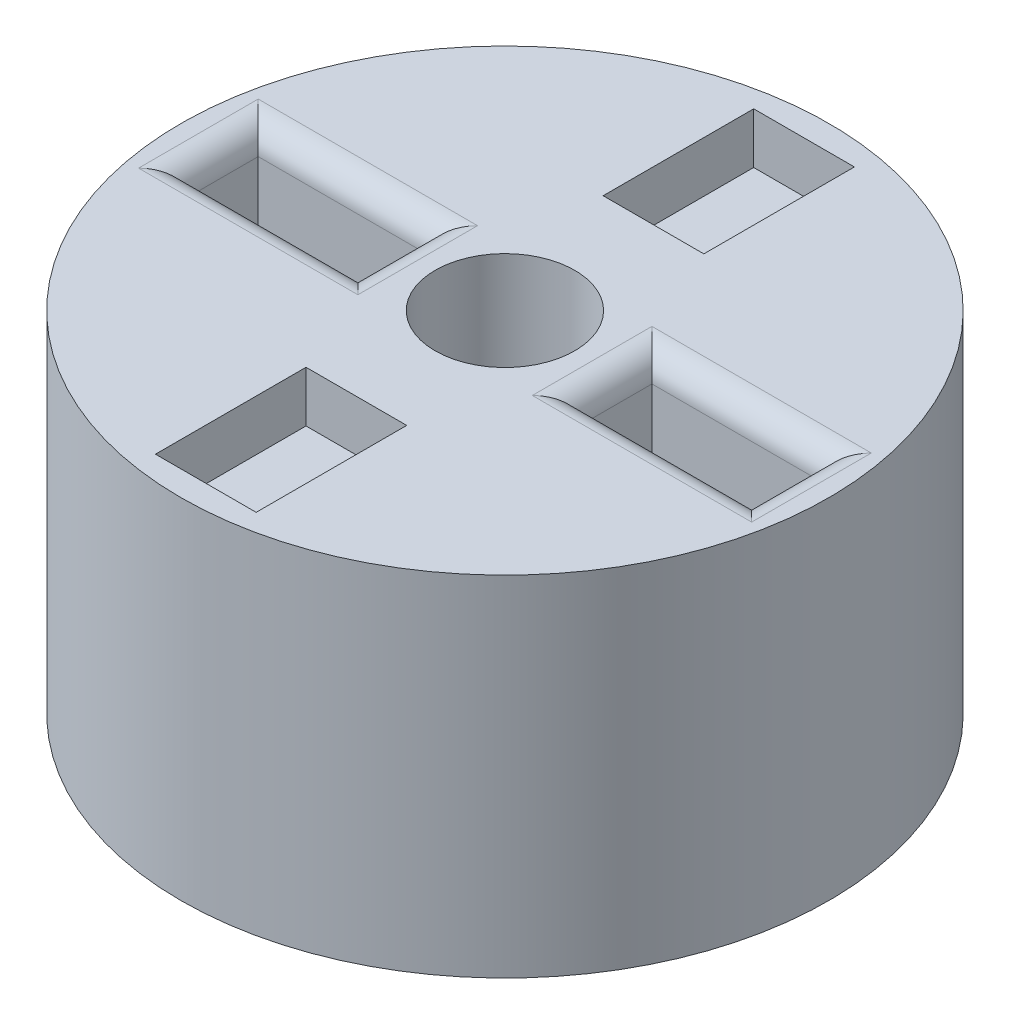
ISO-10303-21;
HEADER;
FILE_DESCRIPTION(('STEP AP214'),'2;1');
FILE_NAME('part.step','',(''),(''),'','','');
FILE_SCHEMA(('AUTOMOTIVE_DESIGN { 1 0 10303 214 1 1 1 1 }'));
ENDSEC;
DATA;
#1=APPLICATION_CONTEXT('core data for automotive mechanical design processes');
#2=APPLICATION_PROTOCOL_DEFINITION('international standard','automotive_design',2000,#1);
#3=PRODUCT_CONTEXT('',#1,'mechanical');
#4=PRODUCT('Part','Part','',(#3));
#5=PRODUCT_RELATED_PRODUCT_CATEGORY('part','',(#4));
#6=PRODUCT_DEFINITION_FORMATION('','',#4);
#7=PRODUCT_DEFINITION_CONTEXT('part definition',#1,'design');
#8=PRODUCT_DEFINITION('design','',#6,#7);
#9=PRODUCT_DEFINITION_SHAPE('','',#8);
#10=(LENGTH_UNIT() NAMED_UNIT(*) SI_UNIT(.MILLI.,.METRE.));
#11=(NAMED_UNIT(*) PLANE_ANGLE_UNIT() SI_UNIT($,.RADIAN.));
#12=(NAMED_UNIT(*) SI_UNIT($,.STERADIAN.) SOLID_ANGLE_UNIT());
#13=UNCERTAINTY_MEASURE_WITH_UNIT(LENGTH_MEASURE(1.E-05),#10,'distance_accuracy_value','');
#14=(GEOMETRIC_REPRESENTATION_CONTEXT(3) GLOBAL_UNCERTAINTY_ASSIGNED_CONTEXT((#13)) GLOBAL_UNIT_ASSIGNED_CONTEXT((#10,
#11,#12)) REPRESENTATION_CONTEXT('',''));
#15=CARTESIAN_POINT('',(0.,0.,0.));
#16=DIRECTION('',(0.,0.,1.));
#17=DIRECTION('',(1.,0.,0.));
#18=AXIS2_PLACEMENT_3D('',#15,#16,#17);
#19=CARTESIAN_POINT('',(0.,35.,0.));
#20=DIRECTION('',(0.,-1.,0.));
#21=DIRECTION('',(0.,0.,-1.));
#22=AXIS2_PLACEMENT_3D('',#19,#20,#21);
#23=CYLINDRICAL_SURFACE('',#22,32.5);
#24=CARTESIAN_POINT('',(0.,35.,0.));
#25=DIRECTION('',(0.,1.,0.));
#26=DIRECTION('',(0.,0.,1.));
#27=AXIS2_PLACEMENT_3D('',#24,#25,#26);
#28=CIRCLE('',#27,32.5);
#29=CARTESIAN_POINT('',(0.,35.,32.5));
#30=VERTEX_POINT('',#29);
#31=EDGE_CURVE('E307',#30,#30,#28,.T.);
#32=ORIENTED_EDGE('',*,*,#31,.F.);
#33=EDGE_LOOP('',(#32));
#34=FACE_BOUND('',#33,.T.);
#35=CARTESIAN_POINT('',(0.,0.,0.));
#36=DIRECTION('',(0.,1.,0.));
#37=DIRECTION('',(0.,0.,1.));
#38=AXIS2_PLACEMENT_3D('',#35,#36,#37);
#39=CIRCLE('',#38,32.5);
#40=CARTESIAN_POINT('',(0.,0.,32.5));
#41=VERTEX_POINT('',#40);
#42=EDGE_CURVE('E270',#41,#41,#39,.T.);
#43=ORIENTED_EDGE('',*,*,#42,.T.);
#44=EDGE_LOOP('',(#43));
#45=FACE_BOUND('',#44,.T.);
#46=ADVANCED_FACE('F41',(#34,#45),#23,.T.);
#47=CARTESIAN_POINT('',(0.,35.,0.));
#48=DIRECTION('',(0.,1.,0.));
#49=DIRECTION('',(0.,0.,1.));
#50=AXIS2_PLACEMENT_3D('',#47,#48,#49);
#51=PLANE('',#50);
#52=DIRECTION('',(-1.,0.,0.));
#53=VECTOR('',#52,1.);
#54=CARTESIAN_POINT('',(28.2461754734144,35.,-6.));
#55=LINE('',#54,#53);
#56=CARTESIAN_POINT('',(8.74617547341436,35.,-6.));
#57=VERTEX_POINT('',#56);
#58=CARTESIAN_POINT('',(30.7461754734144,35.,-6.));
#59=VERTEX_POINT('',#58);
#60=EDGE_CURVE('E322',#57,#59,#55,.F.);
#61=ORIENTED_EDGE('',*,*,#60,.T.);
#62=DIRECTION('',(0.,0.,-1.));
#63=VECTOR('',#62,1.);
#64=CARTESIAN_POINT('',(30.7461754734144,35.,3.5));
#65=LINE('',#64,#63);
#66=CARTESIAN_POINT('',(30.7461754734144,35.,6.));
#67=VERTEX_POINT('',#66);
#68=EDGE_CURVE('E328',#59,#67,#65,.F.);
#69=ORIENTED_EDGE('',*,*,#68,.T.);
#70=DIRECTION('',(1.,0.,0.));
#71=VECTOR('',#70,1.);
#72=CARTESIAN_POINT('',(11.2461754734144,35.,6.));
#73=LINE('',#72,#71);
#74=CARTESIAN_POINT('',(8.74617547341436,35.,6.));
#75=VERTEX_POINT('',#74);
#76=EDGE_CURVE('E326',#67,#75,#73,.F.);
#77=ORIENTED_EDGE('',*,*,#76,.T.);
#78=DIRECTION('',(0.,0.,1.));
#79=VECTOR('',#78,1.);
#80=CARTESIAN_POINT('',(8.74617547341436,35.,-3.5));
#81=LINE('',#80,#79);
#82=EDGE_CURVE('E324',#75,#57,#81,.F.);
#83=ORIENTED_EDGE('',*,*,#82,.T.);
#84=EDGE_LOOP('',(#61,#69,#77,#83));
#85=FACE_BOUND('',#84,.T.);
#86=DIRECTION('',(1.,0.,0.));
#87=VECTOR('',#86,1.);
#88=CARTESIAN_POINT('',(-28.2461754734144,35.,6.));
#89=LINE('',#88,#87);
#90=CARTESIAN_POINT('',(-8.74617547341436,35.,6.));
#91=VERTEX_POINT('',#90);
#92=CARTESIAN_POINT('',(-30.7461754734144,35.,6.));
#93=VERTEX_POINT('',#92);
#94=EDGE_CURVE('E317',#91,#93,#89,.F.);
#95=ORIENTED_EDGE('',*,*,#94,.T.);
#96=DIRECTION('',(0.,0.,1.));
#97=VECTOR('',#96,1.);
#98=CARTESIAN_POINT('',(-30.7461754734144,35.,-3.5));
#99=LINE('',#98,#97);
#100=CARTESIAN_POINT('',(-30.7461754734144,35.,-6.));
#101=VERTEX_POINT('',#100);
#102=EDGE_CURVE('E319',#93,#101,#99,.F.);
#103=ORIENTED_EDGE('',*,*,#102,.T.);
#104=DIRECTION('',(-1.,0.,0.));
#105=VECTOR('',#104,1.);
#106=CARTESIAN_POINT('',(-11.2461754734144,35.,-6.));
#107=LINE('',#106,#105);
#108=CARTESIAN_POINT('',(-8.74617547341436,35.,-6.));
#109=VERTEX_POINT('',#108);
#110=EDGE_CURVE('E313',#101,#109,#107,.F.);
#111=ORIENTED_EDGE('',*,*,#110,.T.);
#112=DIRECTION('',(0.,0.,-1.));
#113=VECTOR('',#112,1.);
#114=CARTESIAN_POINT('',(-8.74617547341436,35.,3.5));
#115=LINE('',#114,#113);
#116=EDGE_CURVE('E315',#109,#91,#115,.F.);
#117=ORIENTED_EDGE('',*,*,#116,.T.);
#118=EDGE_LOOP('',(#95,#103,#111,#117));
#119=FACE_BOUND('',#118,.T.);
#120=CARTESIAN_POINT('',(0.,35.,0.));
#121=DIRECTION('',(0.,1.,0.));
#122=DIRECTION('',(0.,0.,1.));
#123=AXIS2_PLACEMENT_3D('',#120,#121,#122);
#124=CIRCLE('',#123,7.);
#125=CARTESIAN_POINT('',(0.,35.,7.));
#126=VERTEX_POINT('',#125);
#127=EDGE_CURVE('E214',#126,#126,#124,.T.);
#128=ORIENTED_EDGE('',*,*,#127,.F.);
#129=EDGE_LOOP('',(#128));
#130=FACE_BOUND('',#129,.T.);
#131=DIRECTION('',(0.,0.,-1.));
#132=VECTOR('',#131,1.);
#133=CARTESIAN_POINT('',(5.05,35.,-30.));
#134=LINE('',#133,#132);
#135=CARTESIAN_POINT('',(5.05,35.,-14.9));
#136=VERTEX_POINT('',#135);
#137=CARTESIAN_POINT('',(5.05,35.,-30.));
#138=VERTEX_POINT('',#137);
#139=EDGE_CURVE('E257',#136,#138,#134,.T.);
#140=ORIENTED_EDGE('',*,*,#139,.F.);
#141=DIRECTION('',(1.,0.,0.));
#142=VECTOR('',#141,1.);
#143=CARTESIAN_POINT('',(-5.05,35.,-14.9));
#144=LINE('',#143,#142);
#145=CARTESIAN_POINT('',(-5.05,35.,-14.9));
#146=VERTEX_POINT('',#145);
#147=EDGE_CURVE('E247',#146,#136,#144,.T.);
#148=ORIENTED_EDGE('',*,*,#147,.F.);
#149=DIRECTION('',(0.,0.,1.));
#150=VECTOR('',#149,1.);
#151=CARTESIAN_POINT('',(-5.05,35.,-30.));
#152=LINE('',#151,#150);
#153=CARTESIAN_POINT('',(-5.05,35.,-30.));
#154=VERTEX_POINT('',#153);
#155=EDGE_CURVE('E263',#154,#146,#152,.T.);
#156=ORIENTED_EDGE('',*,*,#155,.F.);
#157=DIRECTION('',(-1.,0.,0.));
#158=VECTOR('',#157,1.);
#159=CARTESIAN_POINT('',(-5.05,35.,-30.));
#160=LINE('',#159,#158);
#161=EDGE_CURVE('E259',#138,#154,#160,.T.);
#162=ORIENTED_EDGE('',*,*,#161,.F.);
#163=EDGE_LOOP('',(#140,#148,#156,#162));
#164=FACE_BOUND('',#163,.T.);
#165=DIRECTION('',(1.,0.,0.));
#166=VECTOR('',#165,1.);
#167=CARTESIAN_POINT('',(-5.04999999999999,35.,30.));
#168=LINE('',#167,#166);
#169=CARTESIAN_POINT('',(-5.04999999999999,35.,30.));
#170=VERTEX_POINT('',#169);
#171=CARTESIAN_POINT('',(5.05,35.,30.));
#172=VERTEX_POINT('',#171);
#173=EDGE_CURVE('E260',#170,#172,#168,.T.);
#174=ORIENTED_EDGE('',*,*,#173,.F.);
#175=DIRECTION('',(0.,0.,1.));
#176=VECTOR('',#175,1.);
#177=CARTESIAN_POINT('',(-5.04999999999999,35.,30.));
#178=LINE('',#177,#176);
#179=CARTESIAN_POINT('',(-5.04999999999999,35.,14.9));
#180=VERTEX_POINT('',#179);
#181=EDGE_CURVE('E286',#180,#170,#178,.T.);
#182=ORIENTED_EDGE('',*,*,#181,.F.);
#183=DIRECTION('',(-1.,0.,0.));
#184=VECTOR('',#183,1.);
#185=CARTESIAN_POINT('',(-5.04999999999999,35.,14.9));
#186=LINE('',#185,#184);
#187=CARTESIAN_POINT('',(5.05,35.,14.9));
#188=VERTEX_POINT('',#187);
#189=EDGE_CURVE('E289',#188,#180,#186,.T.);
#190=ORIENTED_EDGE('',*,*,#189,.F.);
#191=DIRECTION('',(0.,0.,-1.));
#192=VECTOR('',#191,1.);
#193=CARTESIAN_POINT('',(5.05,35.,30.));
#194=LINE('',#193,#192);
#195=EDGE_CURVE('E293',#172,#188,#194,.T.);
#196=ORIENTED_EDGE('',*,*,#195,.F.);
#197=EDGE_LOOP('',(#174,#182,#190,#196));
#198=FACE_BOUND('',#197,.T.);
#199=ORIENTED_EDGE('',*,*,#31,.T.);
#200=EDGE_LOOP('',(#199));
#201=FACE_BOUND('',#200,.T.);
#202=ADVANCED_FACE('F369',(#85,#119,#130,#164,#198,#201),#51,.T.);
#203=CARTESIAN_POINT('',(0.,0.,0.));
#204=DIRECTION('',(0.,1.,0.));
#205=DIRECTION('',(0.,0.,1.));
#206=AXIS2_PLACEMENT_3D('',#203,#204,#205);
#207=PLANE('',#206);
#208=CARTESIAN_POINT('',(0.,0.,0.));
#209=DIRECTION('',(0.,1.,0.));
#210=DIRECTION('',(0.,0.,1.));
#211=AXIS2_PLACEMENT_3D('',#208,#209,#210);
#212=CIRCLE('',#211,7.);
#213=CARTESIAN_POINT('',(0.,0.,7.));
#214=VERTEX_POINT('',#213);
#215=EDGE_CURVE('E237',#214,#214,#212,.T.);
#216=ORIENTED_EDGE('',*,*,#215,.T.);
#217=EDGE_LOOP('',(#216));
#218=FACE_BOUND('',#217,.T.);
#219=ORIENTED_EDGE('',*,*,#42,.F.);
#220=EDGE_LOOP('',(#219));
#221=FACE_BOUND('',#220,.T.);
#222=ADVANCED_FACE('F406',(#218,#221),#207,.F.);
#223=CARTESIAN_POINT('',(-5.04999999999999,29.9,30.));
#224=DIRECTION('',(0.,0.,1.));
#225=DIRECTION('',(1.,0.,0.));
#226=AXIS2_PLACEMENT_3D('',#223,#224,#225);
#227=PLANE('',#226);
#228=ORIENTED_EDGE('',*,*,#173,.T.);
#229=DIRECTION('',(0.,1.,0.));
#230=VECTOR('',#229,1.);
#231=CARTESIAN_POINT('',(5.05,29.9,30.));
#232=LINE('',#231,#230);
#233=CARTESIAN_POINT('',(5.05,29.9,30.));
#234=VERTEX_POINT('',#233);
#235=EDGE_CURVE('E277',#234,#172,#232,.T.);
#236=ORIENTED_EDGE('',*,*,#235,.F.);
#237=DIRECTION('',(1.,0.,0.));
#238=VECTOR('',#237,1.);
#239=CARTESIAN_POINT('',(-5.04999999999999,29.9,30.));
#240=LINE('',#239,#238);
#241=CARTESIAN_POINT('',(-5.04999999999999,29.9,30.));
#242=VERTEX_POINT('',#241);
#243=EDGE_CURVE('E290',#242,#234,#240,.T.);
#244=ORIENTED_EDGE('',*,*,#243,.F.);
#245=DIRECTION('',(0.,1.,0.));
#246=VECTOR('',#245,1.);
#247=CARTESIAN_POINT('',(-5.04999999999999,29.9,30.));
#248=LINE('',#247,#246);
#249=EDGE_CURVE('E240',#242,#170,#248,.T.);
#250=ORIENTED_EDGE('',*,*,#249,.T.);
#251=EDGE_LOOP('',(#228,#236,#244,#250));
#252=FACE_BOUND('',#251,.T.);
#253=ADVANCED_FACE('F624',(#252),#227,.F.);
#254=CARTESIAN_POINT('',(-5.04999999999999,29.9,30.));
#255=DIRECTION('',(-1.,0.,0.));
#256=DIRECTION('',(0.,0.,1.));
#257=AXIS2_PLACEMENT_3D('',#254,#255,#256);
#258=PLANE('',#257);
#259=ORIENTED_EDGE('',*,*,#181,.T.);
#260=ORIENTED_EDGE('',*,*,#249,.F.);
#261=DIRECTION('',(0.,0.,1.));
#262=VECTOR('',#261,1.);
#263=CARTESIAN_POINT('',(-5.04999999999999,29.9,30.));
#264=LINE('',#263,#262);
#265=CARTESIAN_POINT('',(-5.04999999999999,29.9,14.9));
#266=VERTEX_POINT('',#265);
#267=EDGE_CURVE('E280',#266,#242,#264,.T.);
#268=ORIENTED_EDGE('',*,*,#267,.F.);
#269=DIRECTION('',(0.,1.,0.));
#270=VECTOR('',#269,1.);
#271=CARTESIAN_POINT('',(-5.04999999999999,29.9,14.9));
#272=LINE('',#271,#270);
#273=EDGE_CURVE('E283',#266,#180,#272,.T.);
#274=ORIENTED_EDGE('',*,*,#273,.T.);
#275=EDGE_LOOP('',(#259,#260,#268,#274));
#276=FACE_BOUND('',#275,.T.);
#277=ADVANCED_FACE('F614',(#276),#258,.F.);
#278=CARTESIAN_POINT('',(-5.04999999999999,29.9,14.9));
#279=DIRECTION('',(0.,0.,-1.));
#280=DIRECTION('',(-1.,0.,0.));
#281=AXIS2_PLACEMENT_3D('',#278,#279,#280);
#282=PLANE('',#281);
#283=ORIENTED_EDGE('',*,*,#189,.T.);
#284=ORIENTED_EDGE('',*,*,#273,.F.);
#285=DIRECTION('',(-1.,0.,0.));
#286=VECTOR('',#285,1.);
#287=CARTESIAN_POINT('',(-5.04999999999999,29.9,14.9));
#288=LINE('',#287,#286);
#289=CARTESIAN_POINT('',(5.05,29.9,14.9));
#290=VERTEX_POINT('',#289);
#291=EDGE_CURVE('E299',#290,#266,#288,.T.);
#292=ORIENTED_EDGE('',*,*,#291,.F.);
#293=DIRECTION('',(0.,1.,0.));
#294=VECTOR('',#293,1.);
#295=CARTESIAN_POINT('',(5.05,29.9,14.9));
#296=LINE('',#295,#294);
#297=EDGE_CURVE('E281',#290,#188,#296,.T.);
#298=ORIENTED_EDGE('',*,*,#297,.T.);
#299=EDGE_LOOP('',(#283,#284,#292,#298));
#300=FACE_BOUND('',#299,.T.);
#301=ADVANCED_FACE('F604',(#300),#282,.F.);
#302=CARTESIAN_POINT('',(5.05,29.9,30.));
#303=DIRECTION('',(1.,0.,0.));
#304=DIRECTION('',(0.,0.,-1.));
#305=AXIS2_PLACEMENT_3D('',#302,#303,#304);
#306=PLANE('',#305);
#307=ORIENTED_EDGE('',*,*,#195,.T.);
#308=ORIENTED_EDGE('',*,*,#297,.F.);
#309=DIRECTION('',(0.,0.,-1.));
#310=VECTOR('',#309,1.);
#311=CARTESIAN_POINT('',(5.05,29.9,30.));
#312=LINE('',#311,#310);
#313=EDGE_CURVE('E302',#234,#290,#312,.T.);
#314=ORIENTED_EDGE('',*,*,#313,.F.);
#315=ORIENTED_EDGE('',*,*,#235,.T.);
#316=EDGE_LOOP('',(#307,#308,#314,#315));
#317=FACE_BOUND('',#316,.T.);
#318=ADVANCED_FACE('F594',(#317),#306,.F.);
#319=CARTESIAN_POINT('',(0.,29.9,0.));
#320=DIRECTION('',(0.,1.,0.));
#321=DIRECTION('',(0.,0.,1.));
#322=AXIS2_PLACEMENT_3D('',#319,#320,#321);
#323=PLANE('',#322);
#324=ORIENTED_EDGE('',*,*,#243,.T.);
#325=ORIENTED_EDGE('',*,*,#313,.T.);
#326=ORIENTED_EDGE('',*,*,#291,.T.);
#327=ORIENTED_EDGE('',*,*,#267,.T.);
#328=EDGE_LOOP('',(#324,#325,#326,#327));
#329=FACE_BOUND('',#328,.T.);
#330=ADVANCED_FACE('F584',(#329),#323,.T.);
#331=CARTESIAN_POINT('',(5.05,29.9,-30.));
#332=DIRECTION('',(1.,0.,0.));
#333=DIRECTION('',(0.,0.,-1.));
#334=AXIS2_PLACEMENT_3D('',#331,#332,#333);
#335=PLANE('',#334);
#336=ORIENTED_EDGE('',*,*,#139,.T.);
#337=DIRECTION('',(0.,1.,0.));
#338=VECTOR('',#337,1.);
#339=CARTESIAN_POINT('',(5.05,29.9,-30.));
#340=LINE('',#339,#338);
#341=CARTESIAN_POINT('',(5.05,29.9,-30.));
#342=VERTEX_POINT('',#341);
#343=EDGE_CURVE('E256',#342,#138,#340,.T.);
#344=ORIENTED_EDGE('',*,*,#343,.F.);
#345=DIRECTION('',(0.,0.,-1.));
#346=VECTOR('',#345,1.);
#347=CARTESIAN_POINT('',(5.05,29.9,-30.));
#348=LINE('',#347,#346);
#349=CARTESIAN_POINT('',(5.05,29.9,-14.9));
#350=VERTEX_POINT('',#349);
#351=EDGE_CURVE('E243',#350,#342,#348,.T.);
#352=ORIENTED_EDGE('',*,*,#351,.F.);
#353=DIRECTION('',(0.,1.,0.));
#354=VECTOR('',#353,1.);
#355=CARTESIAN_POINT('',(5.05,29.9,-14.9));
#356=LINE('',#355,#354);
#357=EDGE_CURVE('E268',#350,#136,#356,.T.);
#358=ORIENTED_EDGE('',*,*,#357,.T.);
#359=EDGE_LOOP('',(#336,#344,#352,#358));
#360=FACE_BOUND('',#359,.T.);
#361=ADVANCED_FACE('F574',(#360),#335,.F.);
#362=CARTESIAN_POINT('',(-5.05,29.9,-14.9));
#363=DIRECTION('',(0.,0.,1.));
#364=DIRECTION('',(1.,0.,0.));
#365=AXIS2_PLACEMENT_3D('',#362,#363,#364);
#366=PLANE('',#365);
#367=ORIENTED_EDGE('',*,*,#147,.T.);
#368=ORIENTED_EDGE('',*,*,#357,.F.);
#369=DIRECTION('',(1.,0.,0.));
#370=VECTOR('',#369,1.);
#371=CARTESIAN_POINT('',(-5.05,29.9,-14.9));
#372=LINE('',#371,#370);
#373=CARTESIAN_POINT('',(-5.05,29.9,-14.9));
#374=VERTEX_POINT('',#373);
#375=EDGE_CURVE('E253',#374,#350,#372,.T.);
#376=ORIENTED_EDGE('',*,*,#375,.F.);
#377=DIRECTION('',(0.,1.,0.));
#378=VECTOR('',#377,1.);
#379=CARTESIAN_POINT('',(-5.05,29.9,-14.9));
#380=LINE('',#379,#378);
#381=EDGE_CURVE('E271',#374,#146,#380,.T.);
#382=ORIENTED_EDGE('',*,*,#381,.T.);
#383=EDGE_LOOP('',(#367,#368,#376,#382));
#384=FACE_BOUND('',#383,.T.);
#385=ADVANCED_FACE('F564',(#384),#366,.F.);
#386=CARTESIAN_POINT('',(-5.05,29.9,-30.));
#387=DIRECTION('',(-1.,0.,0.));
#388=DIRECTION('',(0.,0.,1.));
#389=AXIS2_PLACEMENT_3D('',#386,#387,#388);
#390=PLANE('',#389);
#391=ORIENTED_EDGE('',*,*,#155,.T.);
#392=ORIENTED_EDGE('',*,*,#381,.F.);
#393=DIRECTION('',(0.,0.,1.));
#394=VECTOR('',#393,1.);
#395=CARTESIAN_POINT('',(-5.05,29.9,-30.));
#396=LINE('',#395,#394);
#397=CARTESIAN_POINT('',(-5.05,29.9,-30.));
#398=VERTEX_POINT('',#397);
#399=EDGE_CURVE('E250',#398,#374,#396,.T.);
#400=ORIENTED_EDGE('',*,*,#399,.F.);
#401=DIRECTION('',(0.,1.,0.));
#402=VECTOR('',#401,1.);
#403=CARTESIAN_POINT('',(-5.05,29.9,-30.));
#404=LINE('',#403,#402);
#405=EDGE_CURVE('E273',#398,#154,#404,.T.);
#406=ORIENTED_EDGE('',*,*,#405,.T.);
#407=EDGE_LOOP('',(#391,#392,#400,#406));
#408=FACE_BOUND('',#407,.T.);
#409=ADVANCED_FACE('F554',(#408),#390,.F.);
#410=CARTESIAN_POINT('',(-5.05,29.9,-30.));
#411=DIRECTION('',(0.,0.,-1.));
#412=DIRECTION('',(-1.,0.,0.));
#413=AXIS2_PLACEMENT_3D('',#410,#411,#412);
#414=PLANE('',#413);
#415=ORIENTED_EDGE('',*,*,#161,.T.);
#416=ORIENTED_EDGE('',*,*,#405,.F.);
#417=DIRECTION('',(-1.,0.,0.));
#418=VECTOR('',#417,1.);
#419=CARTESIAN_POINT('',(-5.05,29.9,-30.));
#420=LINE('',#419,#418);
#421=EDGE_CURVE('E246',#342,#398,#420,.T.);
#422=ORIENTED_EDGE('',*,*,#421,.F.);
#423=ORIENTED_EDGE('',*,*,#343,.T.);
#424=EDGE_LOOP('',(#415,#416,#422,#423));
#425=FACE_BOUND('',#424,.T.);
#426=ADVANCED_FACE('F544',(#425),#414,.F.);
#427=CARTESIAN_POINT('',(0.,29.9,0.));
#428=DIRECTION('',(0.,1.,0.));
#429=DIRECTION('',(0.,0.,1.));
#430=AXIS2_PLACEMENT_3D('',#427,#428,#429);
#431=PLANE('',#430);
#432=ORIENTED_EDGE('',*,*,#351,.T.);
#433=ORIENTED_EDGE('',*,*,#421,.T.);
#434=ORIENTED_EDGE('',*,*,#399,.T.);
#435=ORIENTED_EDGE('',*,*,#375,.T.);
#436=EDGE_LOOP('',(#432,#433,#434,#435));
#437=FACE_BOUND('',#436,.T.);
#438=ADVANCED_FACE('F533',(#437),#431,.T.);
#439=CARTESIAN_POINT('',(0.,0.,0.));
#440=DIRECTION('',(0.,1.,0.));
#441=DIRECTION('',(0.,0.,1.));
#442=AXIS2_PLACEMENT_3D('',#439,#440,#441);
#443=CYLINDRICAL_SURFACE('',#442,7.);
#444=ORIENTED_EDGE('',*,*,#215,.F.);
#445=EDGE_LOOP('',(#444));
#446=FACE_BOUND('',#445,.T.);
#447=ORIENTED_EDGE('',*,*,#127,.T.);
#448=EDGE_LOOP('',(#447));
#449=FACE_BOUND('',#448,.T.);
#450=ADVANCED_FACE('F526',(#446,#449),#443,.F.);
#451=CARTESIAN_POINT('',(-11.2461754734144,20.,3.5));
#452=DIRECTION('',(0.,0.,1.));
#453=DIRECTION('',(1.,0.,0.));
#454=AXIS2_PLACEMENT_3D('',#451,#452,#453);
#455=PLANE('',#454);
#456=DIRECTION('',(0.,1.,0.));
#457=VECTOR('',#456,1.);
#458=CARTESIAN_POINT('',(-28.2461754734144,20.,3.5));
#459=LINE('',#458,#457);
#460=CARTESIAN_POINT('',(-28.2461754734144,20.,3.5));
#461=VERTEX_POINT('',#460);
#462=CARTESIAN_POINT('',(-28.2461754734144,32.5,3.5));
#463=VERTEX_POINT('',#462);
#464=EDGE_CURVE('E227',#461,#463,#459,.T.);
#465=ORIENTED_EDGE('',*,*,#464,.T.);
#466=DIRECTION('',(1.,0.,0.));
#467=VECTOR('',#466,1.);
#468=CARTESIAN_POINT('',(-11.2461754734144,32.5,3.5));
#469=LINE('',#468,#467);
#470=CARTESIAN_POINT('',(-11.2461754734144,32.5,3.5));
#471=VERTEX_POINT('',#470);
#472=EDGE_CURVE('E65',#463,#471,#469,.T.);
#473=ORIENTED_EDGE('',*,*,#472,.T.);
#474=DIRECTION('',(0.,1.,0.));
#475=VECTOR('',#474,1.);
#476=CARTESIAN_POINT('',(-11.2461754734144,20.,3.5));
#477=LINE('',#476,#475);
#478=CARTESIAN_POINT('',(-11.2461754734144,20.,3.5));
#479=VERTEX_POINT('',#478);
#480=EDGE_CURVE('E219',#479,#471,#477,.T.);
#481=ORIENTED_EDGE('',*,*,#480,.F.);
#482=DIRECTION('',(1.,0.,0.));
#483=VECTOR('',#482,1.);
#484=CARTESIAN_POINT('',(-11.2461754734144,20.,3.5));
#485=LINE('',#484,#483);
#486=EDGE_CURVE('E204',#461,#479,#485,.T.);
#487=ORIENTED_EDGE('',*,*,#486,.F.);
#488=EDGE_LOOP('',(#465,#473,#481,#487));
#489=FACE_BOUND('',#488,.T.);
#490=ADVANCED_FACE('F381',(#489),#455,.F.);
#491=CARTESIAN_POINT('',(-28.2461754734144,20.,3.5));
#492=DIRECTION('',(-1.,0.,0.));
#493=DIRECTION('',(0.,0.,1.));
#494=AXIS2_PLACEMENT_3D('',#491,#492,#493);
#495=PLANE('',#494);
#496=DIRECTION('',(0.,1.,0.));
#497=VECTOR('',#496,1.);
#498=CARTESIAN_POINT('',(-28.2461754734144,20.,-3.5));
#499=LINE('',#498,#497);
#500=CARTESIAN_POINT('',(-28.2461754734144,20.,-3.5));
#501=VERTEX_POINT('',#500);
#502=CARTESIAN_POINT('',(-28.2461754734144,32.5,-3.5));
#503=VERTEX_POINT('',#502);
#504=EDGE_CURVE('E224',#501,#503,#499,.T.);
#505=ORIENTED_EDGE('',*,*,#504,.T.);
#506=DIRECTION('',(0.,0.,1.));
#507=VECTOR('',#506,1.);
#508=CARTESIAN_POINT('',(-28.2461754734144,32.5,3.5));
#509=LINE('',#508,#507);
#510=EDGE_CURVE('E337',#503,#463,#509,.T.);
#511=ORIENTED_EDGE('',*,*,#510,.T.);
#512=ORIENTED_EDGE('',*,*,#464,.F.);
#513=DIRECTION('',(0.,0.,1.));
#514=VECTOR('',#513,1.);
#515=CARTESIAN_POINT('',(-28.2461754734144,20.,3.5));
#516=LINE('',#515,#514);
#517=EDGE_CURVE('E221',#501,#461,#516,.T.);
#518=ORIENTED_EDGE('',*,*,#517,.F.);
#519=EDGE_LOOP('',(#505,#511,#512,#518));
#520=FACE_BOUND('',#519,.T.);
#521=ADVANCED_FACE('F378',(#520),#495,.F.);
#522=CARTESIAN_POINT('',(-11.2461754734144,20.,-3.5));
#523=DIRECTION('',(0.,0.,-1.));
#524=DIRECTION('',(-1.,0.,0.));
#525=AXIS2_PLACEMENT_3D('',#522,#523,#524);
#526=PLANE('',#525);
#527=DIRECTION('',(0.,1.,0.));
#528=VECTOR('',#527,1.);
#529=CARTESIAN_POINT('',(-11.2461754734144,20.,-3.5));
#530=LINE('',#529,#528);
#531=CARTESIAN_POINT('',(-11.2461754734144,20.,-3.5));
#532=VERTEX_POINT('',#531);
#533=CARTESIAN_POINT('',(-11.2461754734144,32.5,-3.5));
#534=VERTEX_POINT('',#533);
#535=EDGE_CURVE('E222',#532,#534,#530,.T.);
#536=ORIENTED_EDGE('',*,*,#535,.T.);
#537=DIRECTION('',(-1.,0.,0.));
#538=VECTOR('',#537,1.);
#539=CARTESIAN_POINT('',(-28.2461754734144,32.5,-3.5));
#540=LINE('',#539,#538);
#541=EDGE_CURVE('E11',#534,#503,#540,.T.);
#542=ORIENTED_EDGE('',*,*,#541,.T.);
#543=ORIENTED_EDGE('',*,*,#504,.F.);
#544=DIRECTION('',(-1.,0.,0.));
#545=VECTOR('',#544,1.);
#546=CARTESIAN_POINT('',(-11.2461754734144,20.,-3.5));
#547=LINE('',#546,#545);
#548=EDGE_CURVE('E232',#532,#501,#547,.T.);
#549=ORIENTED_EDGE('',*,*,#548,.F.);
#550=EDGE_LOOP('',(#536,#542,#543,#549));
#551=FACE_BOUND('',#550,.T.);
#552=ADVANCED_FACE('F387',(#551),#526,.F.);
#553=CARTESIAN_POINT('',(-11.2461754734144,20.,3.5));
#554=DIRECTION('',(1.,0.,0.));
#555=DIRECTION('',(0.,0.,-1.));
#556=AXIS2_PLACEMENT_3D('',#553,#554,#555);
#557=PLANE('',#556);
#558=ORIENTED_EDGE('',*,*,#480,.T.);
#559=DIRECTION('',(0.,0.,-1.));
#560=VECTOR('',#559,1.);
#561=CARTESIAN_POINT('',(-11.2461754734144,32.5,-3.5));
#562=LINE('',#561,#560);
#563=EDGE_CURVE('E50',#471,#534,#562,.T.);
#564=ORIENTED_EDGE('',*,*,#563,.T.);
#565=ORIENTED_EDGE('',*,*,#535,.F.);
#566=DIRECTION('',(0.,0.,-1.));
#567=VECTOR('',#566,1.);
#568=CARTESIAN_POINT('',(-11.2461754734144,20.,3.5));
#569=LINE('',#568,#567);
#570=EDGE_CURVE('E207',#479,#532,#569,.T.);
#571=ORIENTED_EDGE('',*,*,#570,.F.);
#572=EDGE_LOOP('',(#558,#564,#565,#571));
#573=FACE_BOUND('',#572,.T.);
#574=ADVANCED_FACE('F388',(#573),#557,.F.);
#575=CARTESIAN_POINT('',(0.,20.,0.));
#576=DIRECTION('',(0.,-1.,0.));
#577=DIRECTION('',(0.,0.,-1.));
#578=AXIS2_PLACEMENT_3D('',#575,#576,#577);
#579=PLANE('',#578);
#580=ORIENTED_EDGE('',*,*,#486,.T.);
#581=ORIENTED_EDGE('',*,*,#570,.T.);
#582=ORIENTED_EDGE('',*,*,#548,.T.);
#583=ORIENTED_EDGE('',*,*,#517,.T.);
#584=EDGE_LOOP('',(#580,#581,#582,#583));
#585=FACE_BOUND('',#584,.T.);
#586=ADVANCED_FACE('F384',(#585),#579,.F.);
#587=CARTESIAN_POINT('',(28.2461754734144,20.,3.5));
#588=DIRECTION('',(1.,0.,0.));
#589=DIRECTION('',(0.,0.,-1.));
#590=AXIS2_PLACEMENT_3D('',#587,#588,#589);
#591=PLANE('',#590);
#592=DIRECTION('',(0.,1.,0.));
#593=VECTOR('',#592,1.);
#594=CARTESIAN_POINT('',(28.2461754734144,20.,3.5));
#595=LINE('',#594,#593);
#596=CARTESIAN_POINT('',(28.2461754734144,20.,3.5));
#597=VERTEX_POINT('',#596);
#598=CARTESIAN_POINT('',(28.2461754734144,32.5,3.5));
#599=VERTEX_POINT('',#598);
#600=EDGE_CURVE('E212',#597,#599,#595,.T.);
#601=ORIENTED_EDGE('',*,*,#600,.T.);
#602=DIRECTION('',(0.,0.,-1.));
#603=VECTOR('',#602,1.);
#604=CARTESIAN_POINT('',(28.2461754734144,32.5,-3.5));
#605=LINE('',#604,#603);
#606=CARTESIAN_POINT('',(28.2461754734144,32.5,-3.5));
#607=VERTEX_POINT('',#606);
#608=EDGE_CURVE('E188',#599,#607,#605,.T.);
#609=ORIENTED_EDGE('',*,*,#608,.T.);
#610=DIRECTION('',(0.,1.,0.));
#611=VECTOR('',#610,1.);
#612=CARTESIAN_POINT('',(28.2461754734144,20.,-3.5));
#613=LINE('',#612,#611);
#614=CARTESIAN_POINT('',(28.2461754734144,20.,-3.5));
#615=VERTEX_POINT('',#614);
#616=EDGE_CURVE('E180',#615,#607,#613,.T.);
#617=ORIENTED_EDGE('',*,*,#616,.F.);
#618=DIRECTION('',(0.,0.,-1.));
#619=VECTOR('',#618,1.);
#620=CARTESIAN_POINT('',(28.2461754734144,20.,3.5));
#621=LINE('',#620,#619);
#622=EDGE_CURVE('E185',#597,#615,#621,.T.);
#623=ORIENTED_EDGE('',*,*,#622,.F.);
#624=EDGE_LOOP('',(#601,#609,#617,#623));
#625=FACE_BOUND('',#624,.T.);
#626=ADVANCED_FACE('F183',(#625),#591,.F.);
#627=CARTESIAN_POINT('',(11.2461754734144,20.,3.5));
#628=DIRECTION('',(0.,0.,1.));
#629=DIRECTION('',(1.,0.,0.));
#630=AXIS2_PLACEMENT_3D('',#627,#628,#629);
#631=PLANE('',#630);
#632=DIRECTION('',(0.,1.,0.));
#633=VECTOR('',#632,1.);
#634=CARTESIAN_POINT('',(11.2461754734144,20.,3.5));
#635=LINE('',#634,#633);
#636=CARTESIAN_POINT('',(11.2461754734144,20.,3.5));
#637=VERTEX_POINT('',#636);
#638=CARTESIAN_POINT('',(11.2461754734144,32.5,3.5));
#639=VERTEX_POINT('',#638);
#640=EDGE_CURVE('E215',#637,#639,#635,.T.);
#641=ORIENTED_EDGE('',*,*,#640,.T.);
#642=DIRECTION('',(1.,0.,0.));
#643=VECTOR('',#642,1.);
#644=CARTESIAN_POINT('',(28.2461754734144,32.5,3.5));
#645=LINE('',#644,#643);
#646=EDGE_CURVE('E331',#639,#599,#645,.T.);
#647=ORIENTED_EDGE('',*,*,#646,.T.);
#648=ORIENTED_EDGE('',*,*,#600,.F.);
#649=DIRECTION('',(1.,0.,0.));
#650=VECTOR('',#649,1.);
#651=CARTESIAN_POINT('',(11.2461754734144,20.,3.5));
#652=LINE('',#651,#650);
#653=EDGE_CURVE('E191',#637,#597,#652,.T.);
#654=ORIENTED_EDGE('',*,*,#653,.F.);
#655=EDGE_LOOP('',(#641,#647,#648,#654));
#656=FACE_BOUND('',#655,.T.);
#657=ADVANCED_FACE('F474',(#656),#631,.F.);
#658=CARTESIAN_POINT('',(11.2461754734144,20.,3.5));
#659=DIRECTION('',(-1.,0.,0.));
#660=DIRECTION('',(0.,0.,1.));
#661=AXIS2_PLACEMENT_3D('',#658,#659,#660);
#662=PLANE('',#661);
#663=DIRECTION('',(0.,1.,0.));
#664=VECTOR('',#663,1.);
#665=CARTESIAN_POINT('',(11.2461754734144,20.,-3.5));
#666=LINE('',#665,#664);
#667=CARTESIAN_POINT('',(11.2461754734144,20.,-3.5));
#668=VERTEX_POINT('',#667);
#669=CARTESIAN_POINT('',(11.2461754734144,32.5,-3.5));
#670=VERTEX_POINT('',#669);
#671=EDGE_CURVE('E190',#668,#670,#666,.T.);
#672=ORIENTED_EDGE('',*,*,#671,.T.);
#673=DIRECTION('',(0.,0.,1.));
#674=VECTOR('',#673,1.);
#675=CARTESIAN_POINT('',(11.2461754734144,32.5,3.5));
#676=LINE('',#675,#674);
#677=EDGE_CURVE('E333',#670,#639,#676,.T.);
#678=ORIENTED_EDGE('',*,*,#677,.T.);
#679=ORIENTED_EDGE('',*,*,#640,.F.);
#680=DIRECTION('',(0.,0.,1.));
#681=VECTOR('',#680,1.);
#682=CARTESIAN_POINT('',(11.2461754734144,20.,3.5));
#683=LINE('',#682,#681);
#684=EDGE_CURVE('E200',#668,#637,#683,.T.);
#685=ORIENTED_EDGE('',*,*,#684,.F.);
#686=EDGE_LOOP('',(#672,#678,#679,#685));
#687=FACE_BOUND('',#686,.T.);
#688=ADVANCED_FACE('F466',(#687),#662,.F.);
#689=CARTESIAN_POINT('',(11.2461754734144,20.,-3.5));
#690=DIRECTION('',(0.,0.,-1.));
#691=DIRECTION('',(-1.,0.,0.));
#692=AXIS2_PLACEMENT_3D('',#689,#690,#691);
#693=PLANE('',#692);
#694=ORIENTED_EDGE('',*,*,#616,.T.);
#695=DIRECTION('',(-1.,0.,0.));
#696=VECTOR('',#695,1.);
#697=CARTESIAN_POINT('',(11.2461754734144,32.5,-3.5));
#698=LINE('',#697,#696);
#699=EDGE_CURVE('E335',#607,#670,#698,.T.);
#700=ORIENTED_EDGE('',*,*,#699,.T.);
#701=ORIENTED_EDGE('',*,*,#671,.F.);
#702=DIRECTION('',(-1.,0.,0.));
#703=VECTOR('',#702,1.);
#704=CARTESIAN_POINT('',(11.2461754734144,20.,-3.5));
#705=LINE('',#704,#703);
#706=EDGE_CURVE('E194',#615,#668,#705,.T.);
#707=ORIENTED_EDGE('',*,*,#706,.F.);
#708=EDGE_LOOP('',(#694,#700,#701,#707));
#709=FACE_BOUND('',#708,.T.);
#710=ADVANCED_FACE('F195',(#709),#693,.F.);
#711=CARTESIAN_POINT('',(0.,20.,0.));
#712=DIRECTION('',(0.,-1.,0.));
#713=DIRECTION('',(0.,0.,-1.));
#714=AXIS2_PLACEMENT_3D('',#711,#712,#713);
#715=PLANE('',#714);
#716=ORIENTED_EDGE('',*,*,#622,.T.);
#717=ORIENTED_EDGE('',*,*,#706,.T.);
#718=ORIENTED_EDGE('',*,*,#684,.T.);
#719=ORIENTED_EDGE('',*,*,#653,.T.);
#720=EDGE_LOOP('',(#716,#717,#718,#719));
#721=FACE_BOUND('',#720,.T.);
#722=ADVANCED_FACE('F202',(#721),#715,.F.);
#723=CARTESIAN_POINT('',(8.74617547341436,32.5,3.5));
#724=DIRECTION('',(0.,0.,-1.));
#725=DIRECTION('',(-1.,0.,0.));
#726=AXIS2_PLACEMENT_3D('',#723,#724,#725);
#727=CYLINDRICAL_SURFACE('',#726,2.5);
#728=CARTESIAN_POINT('',(8.74617547341436,32.5,-6.));
#729=DIRECTION('',(0.707106781186547,0.,-0.707106781186547));
#730=DIRECTION('',(-0.707106781186547,0.,-0.707106781186547));
#731=AXIS2_PLACEMENT_3D('',#728,#729,#730);
#732=ELLIPSE('',#731,3.53553390593274,2.5);
#733=EDGE_CURVE('E346',#57,#670,#732,.T.);
#734=ORIENTED_EDGE('',*,*,#733,.F.);
#735=ORIENTED_EDGE('',*,*,#82,.F.);
#736=CARTESIAN_POINT('',(8.74617547341436,32.5,6.));
#737=DIRECTION('',(-0.707106781186547,0.,-0.707106781186547));
#738=DIRECTION('',(-0.707106781186547,0.,0.707106781186547));
#739=AXIS2_PLACEMENT_3D('',#736,#737,#738);
#740=ELLIPSE('',#739,3.53553390593274,2.5);
#741=EDGE_CURVE('E229',#639,#75,#740,.F.);
#742=ORIENTED_EDGE('',*,*,#741,.F.);
#743=ORIENTED_EDGE('',*,*,#677,.F.);
#744=EDGE_LOOP('',(#734,#735,#742,#743));
#745=FACE_BOUND('',#744,.T.);
#746=ADVANCED_FACE('F424',(#745),#727,.T.);
#747=CARTESIAN_POINT('',(11.2461754734144,32.5,6.));
#748=DIRECTION('',(-1.,0.,0.));
#749=DIRECTION('',(0.,0.,1.));
#750=AXIS2_PLACEMENT_3D('',#747,#748,#749);
#751=CYLINDRICAL_SURFACE('',#750,2.5);
#752=ORIENTED_EDGE('',*,*,#741,.T.);
#753=ORIENTED_EDGE('',*,*,#76,.F.);
#754=CARTESIAN_POINT('',(30.7461754734144,32.5,6.));
#755=DIRECTION('',(-0.707106781186547,0.,0.707106781186547));
#756=DIRECTION('',(0.707106781186547,0.,0.707106781186547));
#757=AXIS2_PLACEMENT_3D('',#754,#755,#756);
#758=ELLIPSE('',#757,3.53553390593274,2.5);
#759=EDGE_CURVE('E344',#599,#67,#758,.F.);
#760=ORIENTED_EDGE('',*,*,#759,.F.);
#761=ORIENTED_EDGE('',*,*,#646,.F.);
#762=EDGE_LOOP('',(#752,#753,#760,#761));
#763=FACE_BOUND('',#762,.T.);
#764=ADVANCED_FACE('F420',(#763),#751,.T.);
#765=CARTESIAN_POINT('',(11.2461754734144,32.5,-6.));
#766=DIRECTION('',(1.,0.,0.));
#767=DIRECTION('',(0.,0.,-1.));
#768=AXIS2_PLACEMENT_3D('',#765,#766,#767);
#769=CYLINDRICAL_SURFACE('',#768,2.5);
#770=ORIENTED_EDGE('',*,*,#733,.T.);
#771=ORIENTED_EDGE('',*,*,#699,.F.);
#772=CARTESIAN_POINT('',(30.7461754734144,32.5,-6.));
#773=DIRECTION('',(0.707106781186547,0.,0.707106781186547));
#774=DIRECTION('',(-0.707106781186547,0.,0.707106781186547));
#775=AXIS2_PLACEMENT_3D('',#772,#773,#774);
#776=ELLIPSE('',#775,3.53553390593274,2.5);
#777=EDGE_CURVE('E342',#59,#607,#776,.T.);
#778=ORIENTED_EDGE('',*,*,#777,.F.);
#779=ORIENTED_EDGE('',*,*,#60,.F.);
#780=EDGE_LOOP('',(#770,#771,#778,#779));
#781=FACE_BOUND('',#780,.T.);
#782=ADVANCED_FACE('F416',(#781),#769,.T.);
#783=CARTESIAN_POINT('',(30.7461754734144,32.5,3.5));
#784=DIRECTION('',(0.,0.,1.));
#785=DIRECTION('',(1.,0.,0.));
#786=AXIS2_PLACEMENT_3D('',#783,#784,#785);
#787=CYLINDRICAL_SURFACE('',#786,2.5);
#788=ORIENTED_EDGE('',*,*,#759,.T.);
#789=ORIENTED_EDGE('',*,*,#68,.F.);
#790=ORIENTED_EDGE('',*,*,#777,.T.);
#791=ORIENTED_EDGE('',*,*,#608,.F.);
#792=EDGE_LOOP('',(#788,#789,#790,#791));
#793=FACE_BOUND('',#792,.T.);
#794=ADVANCED_FACE('F413',(#793),#787,.T.);
#795=CARTESIAN_POINT('',(-8.74617547341436,32.5,3.5));
#796=DIRECTION('',(0.,0.,1.));
#797=DIRECTION('',(1.,0.,0.));
#798=AXIS2_PLACEMENT_3D('',#795,#796,#797);
#799=CYLINDRICAL_SURFACE('',#798,2.5);
#800=CARTESIAN_POINT('',(-8.74617547341436,32.5,6.));
#801=DIRECTION('',(-0.707106781186547,0.,0.707106781186547));
#802=DIRECTION('',(-0.707106781186547,0.,-0.707106781186547));
#803=AXIS2_PLACEMENT_3D('',#800,#801,#802);
#804=ELLIPSE('',#803,3.53553390593274,2.5);
#805=EDGE_CURVE('E354',#91,#471,#804,.T.);
#806=ORIENTED_EDGE('',*,*,#805,.F.);
#807=ORIENTED_EDGE('',*,*,#116,.F.);
#808=CARTESIAN_POINT('',(-8.74617547341436,32.5,-6.));
#809=DIRECTION('',(0.707106781186547,0.,0.707106781186547));
#810=DIRECTION('',(-0.707106781186547,0.,0.707106781186547));
#811=AXIS2_PLACEMENT_3D('',#808,#809,#810);
#812=ELLIPSE('',#811,3.53553390593274,2.5);
#813=EDGE_CURVE('E45',#534,#109,#812,.F.);
#814=ORIENTED_EDGE('',*,*,#813,.F.);
#815=ORIENTED_EDGE('',*,*,#563,.F.);
#816=EDGE_LOOP('',(#806,#807,#814,#815));
#817=FACE_BOUND('',#816,.T.);
#818=ADVANCED_FACE('F43',(#817),#799,.T.);
#819=CARTESIAN_POINT('',(-11.2461754734144,32.5,-6.));
#820=DIRECTION('',(1.,0.,0.));
#821=DIRECTION('',(0.,0.,-1.));
#822=AXIS2_PLACEMENT_3D('',#819,#820,#821);
#823=CYLINDRICAL_SURFACE('',#822,2.5);
#824=ORIENTED_EDGE('',*,*,#813,.T.);
#825=ORIENTED_EDGE('',*,*,#110,.F.);
#826=CARTESIAN_POINT('',(-30.7461754734144,32.5,-6.));
#827=DIRECTION('',(0.707106781186547,0.,-0.707106781186547));
#828=DIRECTION('',(-0.707106781186547,0.,-0.707106781186547));
#829=AXIS2_PLACEMENT_3D('',#826,#827,#828);
#830=ELLIPSE('',#829,3.53553390593274,2.5);
#831=EDGE_CURVE('E353',#503,#101,#830,.F.);
#832=ORIENTED_EDGE('',*,*,#831,.F.);
#833=ORIENTED_EDGE('',*,*,#541,.F.);
#834=EDGE_LOOP('',(#824,#825,#832,#833));
#835=FACE_BOUND('',#834,.T.);
#836=ADVANCED_FACE('F364',(#835),#823,.T.);
#837=CARTESIAN_POINT('',(-11.2461754734144,32.5,6.));
#838=DIRECTION('',(-1.,0.,0.));
#839=DIRECTION('',(0.,0.,1.));
#840=AXIS2_PLACEMENT_3D('',#837,#838,#839);
#841=CYLINDRICAL_SURFACE('',#840,2.5);
#842=ORIENTED_EDGE('',*,*,#805,.T.);
#843=ORIENTED_EDGE('',*,*,#472,.F.);
#844=CARTESIAN_POINT('',(-30.7461754734144,32.5,6.));
#845=DIRECTION('',(-0.707106781186547,0.,-0.707106781186547));
#846=DIRECTION('',(0.707106781186547,0.,-0.707106781186547));
#847=AXIS2_PLACEMENT_3D('',#844,#845,#846);
#848=ELLIPSE('',#847,3.53553390593274,2.5);
#849=EDGE_CURVE('E351',#93,#463,#848,.T.);
#850=ORIENTED_EDGE('',*,*,#849,.F.);
#851=ORIENTED_EDGE('',*,*,#94,.F.);
#852=EDGE_LOOP('',(#842,#843,#850,#851));
#853=FACE_BOUND('',#852,.T.);
#854=ADVANCED_FACE('F376',(#853),#841,.T.);
#855=CARTESIAN_POINT('',(-30.7461754734144,32.5,3.5));
#856=DIRECTION('',(0.,0.,-1.));
#857=DIRECTION('',(-1.,0.,0.));
#858=AXIS2_PLACEMENT_3D('',#855,#856,#857);
#859=CYLINDRICAL_SURFACE('',#858,2.5);
#860=ORIENTED_EDGE('',*,*,#831,.T.);
#861=ORIENTED_EDGE('',*,*,#102,.F.);
#862=ORIENTED_EDGE('',*,*,#849,.T.);
#863=ORIENTED_EDGE('',*,*,#510,.F.);
#864=EDGE_LOOP('',(#860,#861,#862,#863));
#865=FACE_BOUND('',#864,.T.);
#866=ADVANCED_FACE('F374',(#865),#859,.T.);
#867=CLOSED_SHELL('',(#46,#202,#222,#253,#277,#301,#318,#330,#361,#385,#409,#426,#438,#450,#490,
#521,#552,#574,#586,#626,#657,#688,#710,#722,#746,#764,#782,#794,#818,#836,#854,#866));
#868=MANIFOLD_SOLID_BREP('B2',#867);
#869=ADVANCED_BREP_SHAPE_REPRESENTATION('',(#18,#868),#14);
#870=SHAPE_DEFINITION_REPRESENTATION(#9,#869);
ENDSEC;
END-ISO-10303-21;
